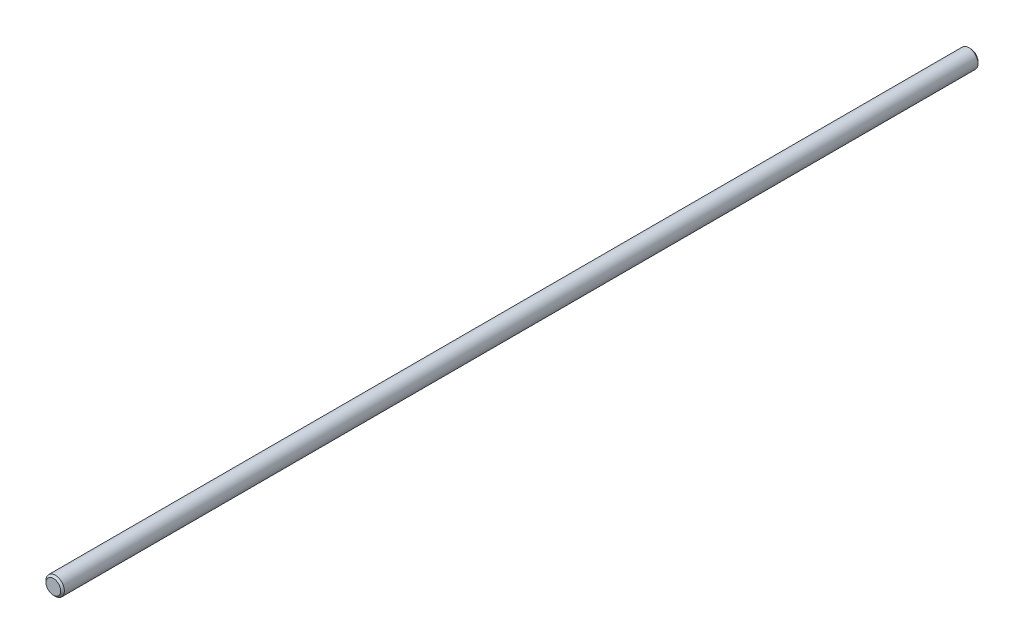
ISO-10303-21;
HEADER;
FILE_DESCRIPTION(('STEP AP214'),'2;1');
FILE_NAME('part.step','',(''),(''),'','','');
FILE_SCHEMA(('AUTOMOTIVE_DESIGN { 1 0 10303 214 1 1 1 1 }'));
ENDSEC;
DATA;
#1=APPLICATION_CONTEXT('core data for automotive mechanical design processes');
#2=APPLICATION_PROTOCOL_DEFINITION('international standard','automotive_design',2000,#1);
#3=PRODUCT_CONTEXT('',#1,'mechanical');
#4=PRODUCT('Part','Part','',(#3));
#5=PRODUCT_RELATED_PRODUCT_CATEGORY('part','',(#4));
#6=PRODUCT_DEFINITION_FORMATION('','',#4);
#7=PRODUCT_DEFINITION_CONTEXT('part definition',#1,'design');
#8=PRODUCT_DEFINITION('design','',#6,#7);
#9=PRODUCT_DEFINITION_SHAPE('','',#8);
#10=(LENGTH_UNIT() NAMED_UNIT(*) SI_UNIT(.MILLI.,.METRE.));
#11=(NAMED_UNIT(*) PLANE_ANGLE_UNIT() SI_UNIT($,.RADIAN.));
#12=(NAMED_UNIT(*) SI_UNIT($,.STERADIAN.) SOLID_ANGLE_UNIT());
#13=UNCERTAINTY_MEASURE_WITH_UNIT(LENGTH_MEASURE(1.E-05),#10,'distance_accuracy_value','');
#14=(GEOMETRIC_REPRESENTATION_CONTEXT(3) GLOBAL_UNCERTAINTY_ASSIGNED_CONTEXT((#13)) GLOBAL_UNIT_ASSIGNED_CONTEXT((#10,
#11,#12)) REPRESENTATION_CONTEXT('',''));
#15=CARTESIAN_POINT('',(0.,0.,0.));
#16=DIRECTION('',(0.,0.,1.));
#17=DIRECTION('',(1.,0.,0.));
#18=AXIS2_PLACEMENT_3D('',#15,#16,#17);
#19=CARTESIAN_POINT('',(0.,0.,500.));
#20=DIRECTION('',(0.,0.,-1.));
#21=DIRECTION('',(-1.,0.,0.));
#22=AXIS2_PLACEMENT_3D('',#19,#20,#21);
#23=CYLINDRICAL_SURFACE('',#22,10.);
#24=CARTESIAN_POINT('',(0.,0.,-498.));
#25=DIRECTION('',(0.,0.,1.));
#26=DIRECTION('',(1.,0.,0.));
#27=AXIS2_PLACEMENT_3D('',#24,#25,#26);
#28=CIRCLE('',#27,10.);
#29=CARTESIAN_POINT('',(10.,0.,-498.));
#30=VERTEX_POINT('',#29);
#31=EDGE_CURVE('E41',#30,#30,#28,.T.);
#32=ORIENTED_EDGE('',*,*,#31,.T.);
#33=EDGE_LOOP('',(#32));
#34=FACE_BOUND('',#33,.T.);
#35=CARTESIAN_POINT('',(0.,0.,498.));
#36=DIRECTION('',(0.,0.,1.));
#37=DIRECTION('',(1.,0.,0.));
#38=AXIS2_PLACEMENT_3D('',#35,#36,#37);
#39=CIRCLE('',#38,10.);
#40=CARTESIAN_POINT('',(10.,0.,498.));
#41=VERTEX_POINT('',#40);
#42=EDGE_CURVE('E45',#41,#41,#39,.F.);
#43=ORIENTED_EDGE('',*,*,#42,.T.);
#44=EDGE_LOOP('',(#43));
#45=FACE_BOUND('',#44,.T.);
#46=ADVANCED_FACE('F30',(#34,#45),#23,.T.);
#47=CARTESIAN_POINT('',(0.,0.,500.));
#48=DIRECTION('',(0.,0.,1.));
#49=DIRECTION('',(1.,0.,0.));
#50=AXIS2_PLACEMENT_3D('',#47,#48,#49);
#51=PLANE('',#50);
#52=CARTESIAN_POINT('',(0.,0.,500.));
#53=DIRECTION('',(0.,0.,1.));
#54=DIRECTION('',(1.,0.,0.));
#55=AXIS2_PLACEMENT_3D('',#52,#53,#54);
#56=CIRCLE('',#55,8.00000000000034);
#57=CARTESIAN_POINT('',(8.00000000000034,0.,500.));
#58=VERTEX_POINT('',#57);
#59=EDGE_CURVE('E10',#58,#58,#56,.T.);
#60=ORIENTED_EDGE('',*,*,#59,.T.);
#61=EDGE_LOOP('',(#60));
#62=FACE_BOUND('',#61,.T.);
#63=ADVANCED_FACE('F61',(#62),#51,.T.);
#64=CARTESIAN_POINT('',(0.,0.,-500.));
#65=DIRECTION('',(0.,0.,1.));
#66=DIRECTION('',(1.,0.,0.));
#67=AXIS2_PLACEMENT_3D('',#64,#65,#66);
#68=PLANE('',#67);
#69=CARTESIAN_POINT('',(0.,0.,-500.));
#70=DIRECTION('',(0.,0.,1.));
#71=DIRECTION('',(1.,0.,0.));
#72=AXIS2_PLACEMENT_3D('',#69,#70,#71);
#73=CIRCLE('',#72,8.00000000000001);
#74=CARTESIAN_POINT('',(8.00000000000001,0.,-500.));
#75=VERTEX_POINT('',#74);
#76=EDGE_CURVE('E37',#75,#75,#73,.F.);
#77=ORIENTED_EDGE('',*,*,#76,.T.);
#78=EDGE_LOOP('',(#77));
#79=FACE_BOUND('',#78,.T.);
#80=ADVANCED_FACE('F58',(#79),#68,.F.);
#81=CARTESIAN_POINT('',(0.,0.,-498.));
#82=DIRECTION('',(0.,0.,1.));
#83=DIRECTION('',(1.,0.,0.));
#84=AXIS2_PLACEMENT_3D('',#81,#82,#83);
#85=CONICAL_SURFACE('',#84,10.,0.785398163397446);
#86=ORIENTED_EDGE('',*,*,#76,.F.);
#87=EDGE_LOOP('',(#86));
#88=FACE_BOUND('',#87,.T.);
#89=ORIENTED_EDGE('',*,*,#31,.F.);
#90=EDGE_LOOP('',(#89));
#91=FACE_BOUND('',#90,.T.);
#92=ADVANCED_FACE('F54',(#88,#91),#85,.T.);
#93=CARTESIAN_POINT('',(0.,0.,500.));
#94=DIRECTION('',(0.,0.,-1.));
#95=DIRECTION('',(-1.,0.,0.));
#96=AXIS2_PLACEMENT_3D('',#93,#94,#95);
#97=CONICAL_SURFACE('',#96,8.00000000000034,0.785398163397446);
#98=ORIENTED_EDGE('',*,*,#42,.F.);
#99=EDGE_LOOP('',(#98));
#100=FACE_BOUND('',#99,.T.);
#101=ORIENTED_EDGE('',*,*,#59,.F.);
#102=EDGE_LOOP('',(#101));
#103=FACE_BOUND('',#102,.T.);
#104=ADVANCED_FACE('F32',(#100,#103),#97,.T.);
#105=CLOSED_SHELL('',(#46,#63,#80,#92,#104));
#106=MANIFOLD_SOLID_BREP('B2',#105);
#107=ADVANCED_BREP_SHAPE_REPRESENTATION('',(#18,#106),#14);
#108=SHAPE_DEFINITION_REPRESENTATION(#9,#107);
ENDSEC;
END-ISO-10303-21;
